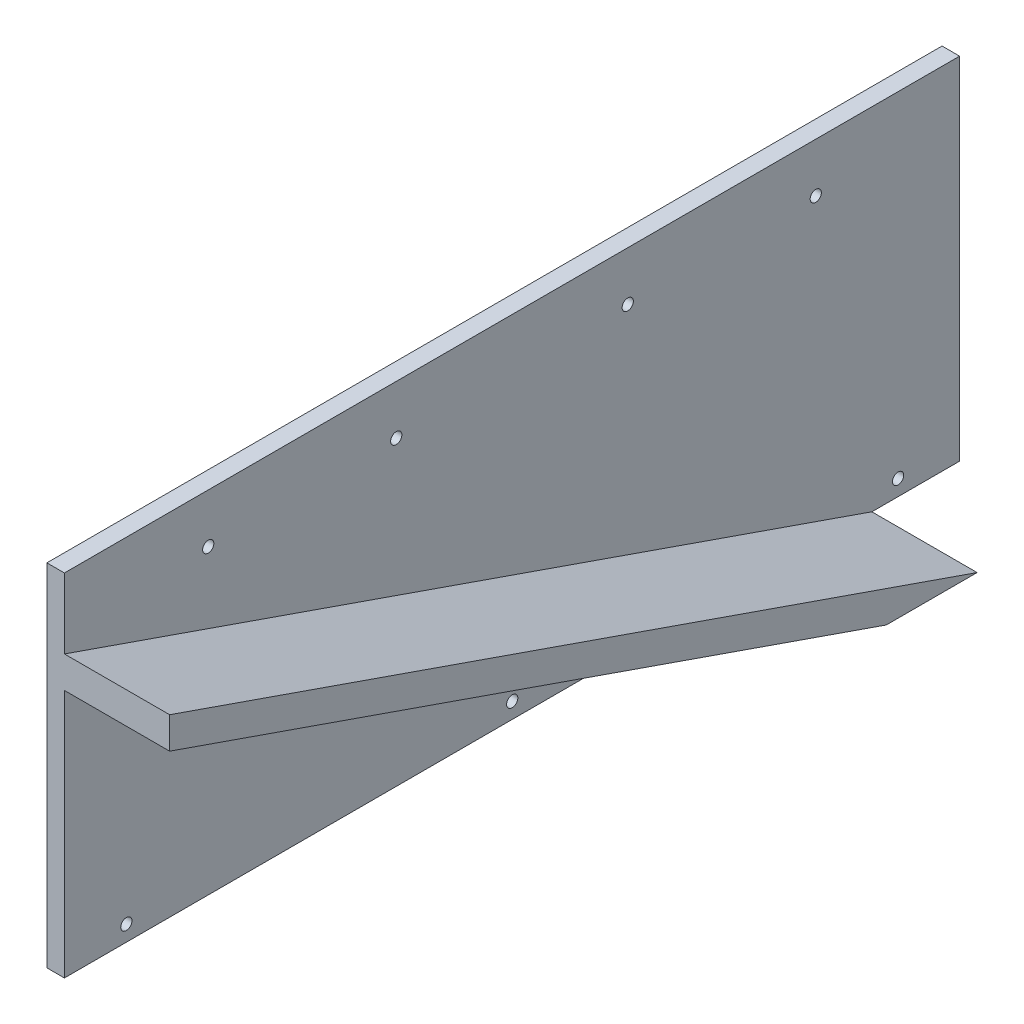
ISO-10303-21;
HEADER;
FILE_DESCRIPTION(('STEP AP214'),'2;1');
FILE_NAME('part.step','',(''),(''),'','','');
FILE_SCHEMA(('AUTOMOTIVE_DESIGN { 1 0 10303 214 1 1 1 1 }'));
ENDSEC;
DATA;
#1=APPLICATION_CONTEXT('core data for automotive mechanical design processes');
#2=APPLICATION_PROTOCOL_DEFINITION('international standard','automotive_design',2000,#1);
#3=PRODUCT_CONTEXT('',#1,'mechanical');
#4=PRODUCT('Part','Part','',(#3));
#5=PRODUCT_RELATED_PRODUCT_CATEGORY('part','',(#4));
#6=PRODUCT_DEFINITION_FORMATION('','',#4);
#7=PRODUCT_DEFINITION_CONTEXT('part definition',#1,'design');
#8=PRODUCT_DEFINITION('design','',#6,#7);
#9=PRODUCT_DEFINITION_SHAPE('','',#8);
#10=(LENGTH_UNIT() NAMED_UNIT(*) SI_UNIT(.MILLI.,.METRE.));
#11=(NAMED_UNIT(*) PLANE_ANGLE_UNIT() SI_UNIT($,.RADIAN.));
#12=(NAMED_UNIT(*) SI_UNIT($,.STERADIAN.) SOLID_ANGLE_UNIT());
#13=UNCERTAINTY_MEASURE_WITH_UNIT(LENGTH_MEASURE(1.E-05),#10,'distance_accuracy_value','');
#14=(GEOMETRIC_REPRESENTATION_CONTEXT(3) GLOBAL_UNCERTAINTY_ASSIGNED_CONTEXT((#13)) GLOBAL_UNIT_ASSIGNED_CONTEXT((#10,
#11,#12)) REPRESENTATION_CONTEXT('',''));
#15=CARTESIAN_POINT('',(0.,0.,0.));
#16=DIRECTION('',(0.,0.,1.));
#17=DIRECTION('',(1.,0.,0.));
#18=AXIS2_PLACEMENT_3D('',#15,#16,#17);
#19=CARTESIAN_POINT('',(171.2,-90.,-19.2));
#20=DIRECTION('',(1.,0.,0.));
#21=DIRECTION('',(0.,0.,-1.));
#22=AXIS2_PLACEMENT_3D('',#19,#20,#21);
#23=PLANE('',#22);
#24=CARTESIAN_POINT('',(171.2,-85.5,-1.65549429597915));
#25=DIRECTION('',(1.,0.,0.));
#26=DIRECTION('',(0.,0.,-1.));
#27=AXIS2_PLACEMENT_3D('',#24,#25,#26);
#28=CIRCLE('',#27,1.6);
#29=CARTESIAN_POINT('',(171.2,-85.5,-3.25549429597916));
#30=VERTEX_POINT('',#29);
#31=EDGE_CURVE('E333',#30,#30,#28,.F.);
#32=ORIENTED_EDGE('',*,*,#31,.T.);
#33=EDGE_LOOP('',(#32));
#34=FACE_BOUND('',#33,.T.);
#35=DIRECTION('',(0.,0.328265971607174,0.944585333299643));
#36=VECTOR('',#35,1.);
#37=CARTESIAN_POINT('',(171.2,-82.1001669584005,28.5317695772026));
#38=LINE('',#37,#36);
#39=CARTESIAN_POINT('',(171.2,-90.,5.8000000000001));
#40=VERTEX_POINT('',#39);
#41=CARTESIAN_POINT('',(171.2,-10.,236.));
#42=VERTEX_POINT('',#41);
#43=EDGE_CURVE('E64',#40,#42,#38,.T.);
#44=ORIENTED_EDGE('',*,*,#43,.F.);
#45=DIRECTION('',(0.,0.,-1.));
#46=VECTOR('',#45,1.);
#47=CARTESIAN_POINT('',(171.2,-90.,-19.2));
#48=LINE('',#47,#46);
#49=CARTESIAN_POINT('',(171.2,-90.,-19.2));
#50=VERTEX_POINT('',#49);
#51=EDGE_CURVE('E175',#40,#50,#48,.T.);
#52=ORIENTED_EDGE('',*,*,#51,.T.);
#53=DIRECTION('',(0.,1.,0.));
#54=VECTOR('',#53,1.);
#55=CARTESIAN_POINT('',(171.2,-90.,-19.2));
#56=LINE('',#55,#54);
#57=CARTESIAN_POINT('',(171.2,10.,-19.2));
#58=VERTEX_POINT('',#57);
#59=EDGE_CURVE('E204',#50,#58,#56,.T.);
#60=ORIENTED_EDGE('',*,*,#59,.T.);
#61=DIRECTION('',(0.,0.,-1.));
#62=VECTOR('',#61,1.);
#63=CARTESIAN_POINT('',(171.2,10.,-19.2));
#64=LINE('',#63,#62);
#65=CARTESIAN_POINT('',(171.2,10.,236.));
#66=VERTEX_POINT('',#65);
#67=EDGE_CURVE('E191',#66,#58,#64,.T.);
#68=ORIENTED_EDGE('',*,*,#67,.F.);
#69=DIRECTION('',(0.,1.,0.));
#70=VECTOR('',#69,1.);
#71=CARTESIAN_POINT('',(171.2,-90.,236.));
#72=LINE('',#71,#70);
#73=EDGE_CURVE('E69',#42,#66,#72,.T.);
#74=ORIENTED_EDGE('',*,*,#73,.F.);
#75=EDGE_LOOP('',(#44,#52,#60,#68,#74));
#76=FACE_BOUND('',#75,.T.);
#77=CARTESIAN_POINT('',(171.2,-3.99999999999998,195.));
#78=DIRECTION('',(-1.,0.,0.));
#79=DIRECTION('',(0.,0.,1.));
#80=AXIS2_PLACEMENT_3D('',#77,#78,#79);
#81=CIRCLE('',#80,1.6);
#82=CARTESIAN_POINT('',(171.2,-3.99999999999998,196.6));
#83=VERTEX_POINT('',#82);
#84=EDGE_CURVE('E144',#83,#83,#81,.T.);
#85=ORIENTED_EDGE('',*,*,#84,.T.);
#86=EDGE_LOOP('',(#85));
#87=FACE_BOUND('',#86,.T.);
#88=CARTESIAN_POINT('',(171.2,-3.99999999999998,21.8));
#89=DIRECTION('',(1.,0.,0.));
#90=DIRECTION('',(0.,0.,-1.));
#91=AXIS2_PLACEMENT_3D('',#88,#89,#90);
#92=CIRCLE('',#91,1.6);
#93=CARTESIAN_POINT('',(171.2,-3.99999999999998,20.2));
#94=VERTEX_POINT('',#93);
#95=EDGE_CURVE('E153',#94,#94,#92,.T.);
#96=ORIENTED_EDGE('',*,*,#95,.F.);
#97=EDGE_LOOP('',(#96));
#98=FACE_BOUND('',#97,.T.);
#99=CARTESIAN_POINT('',(171.2,-3.99999999999998,141.4));
#100=DIRECTION('',(-1.,0.,0.));
#101=DIRECTION('',(0.,0.,1.));
#102=AXIS2_PLACEMENT_3D('',#99,#100,#101);
#103=CIRCLE('',#102,1.60000000000001);
#104=CARTESIAN_POINT('',(171.2,-3.99999999999998,143.));
#105=VERTEX_POINT('',#104);
#106=EDGE_CURVE('E162',#105,#105,#103,.T.);
#107=ORIENTED_EDGE('',*,*,#106,.T.);
#108=EDGE_LOOP('',(#107));
#109=FACE_BOUND('',#108,.T.);
#110=CARTESIAN_POINT('',(171.2,-3.99999999999998,75.4));
#111=DIRECTION('',(1.,0.,0.));
#112=DIRECTION('',(0.,0.,-1.));
#113=AXIS2_PLACEMENT_3D('',#110,#111,#112);
#114=CIRCLE('',#113,1.60000000000001);
#115=CARTESIAN_POINT('',(171.2,-3.99999999999998,73.8));
#116=VERTEX_POINT('',#115);
#117=EDGE_CURVE('E166',#116,#116,#114,.T.);
#118=ORIENTED_EDGE('',*,*,#117,.F.);
#119=EDGE_LOOP('',(#118));
#120=FACE_BOUND('',#119,.T.);
#121=ADVANCED_FACE('F46',(#34,#76,#87,#98,#109,#120),#23,.T.);
#122=CARTESIAN_POINT('',(171.2,-90.,236.));
#123=DIRECTION('',(0.,0.,1.));
#124=DIRECTION('',(1.,0.,0.));
#125=AXIS2_PLACEMENT_3D('',#122,#123,#124);
#126=PLANE('',#125);
#127=DIRECTION('',(1.,0.,0.));
#128=VECTOR('',#127,1.);
#129=CARTESIAN_POINT('',(171.2,10.,236.));
#130=LINE('',#129,#128);
#131=CARTESIAN_POINT('',(166.2,10.,236.));
#132=VERTEX_POINT('',#131);
#133=EDGE_CURVE('E171',#132,#66,#130,.T.);
#134=ORIENTED_EDGE('',*,*,#133,.F.);
#135=DIRECTION('',(0.,1.,0.));
#136=VECTOR('',#135,1.);
#137=CARTESIAN_POINT('',(166.2,-90.,236.));
#138=LINE('',#137,#136);
#139=CARTESIAN_POINT('',(166.2,-90.,236.));
#140=VERTEX_POINT('',#139);
#141=EDGE_CURVE('E11',#140,#132,#138,.T.);
#142=ORIENTED_EDGE('',*,*,#141,.F.);
#143=DIRECTION('',(1.,0.,0.));
#144=VECTOR('',#143,1.);
#145=CARTESIAN_POINT('',(171.2,-90.,236.));
#146=LINE('',#145,#144);
#147=CARTESIAN_POINT('',(171.2,-90.,236.));
#148=VERTEX_POINT('',#147);
#149=EDGE_CURVE('E172',#140,#148,#146,.T.);
#150=ORIENTED_EDGE('',*,*,#149,.T.);
#151=CARTESIAN_POINT('',(171.2,-19.,236.));
#152=VERTEX_POINT('',#151);
#153=EDGE_CURVE('E137',#148,#152,#72,.T.);
#154=ORIENTED_EDGE('',*,*,#153,.T.);
#155=DIRECTION('',(-1.,0.,0.));
#156=VECTOR('',#155,1.);
#157=CARTESIAN_POINT('',(201.2,-19.,236.));
#158=LINE('',#157,#156);
#159=CARTESIAN_POINT('',(201.2,-19.,236.));
#160=VERTEX_POINT('',#159);
#161=EDGE_CURVE('E116',#160,#152,#158,.T.);
#162=ORIENTED_EDGE('',*,*,#161,.F.);
#163=DIRECTION('',(0.,-1.,0.));
#164=VECTOR('',#163,1.);
#165=CARTESIAN_POINT('',(201.2,0.,236.));
#166=LINE('',#165,#164);
#167=CARTESIAN_POINT('',(201.2,-10.,236.));
#168=VERTEX_POINT('',#167);
#169=EDGE_CURVE('E123',#168,#160,#166,.T.);
#170=ORIENTED_EDGE('',*,*,#169,.F.);
#171=DIRECTION('',(-1.,0.,0.));
#172=VECTOR('',#171,1.);
#173=CARTESIAN_POINT('',(201.2,-10.,236.));
#174=LINE('',#173,#172);
#175=EDGE_CURVE('E279',#168,#42,#174,.T.);
#176=ORIENTED_EDGE('',*,*,#175,.T.);
#177=ORIENTED_EDGE('',*,*,#73,.T.);
#178=EDGE_LOOP('',(#134,#142,#150,#154,#162,#170,#176,#177));
#179=FACE_BOUND('',#178,.T.);
#180=ADVANCED_FACE('F48',(#179),#126,.T.);
#181=CARTESIAN_POINT('',(166.2,-90.,236.));
#182=DIRECTION('',(-1.,0.,0.));
#183=DIRECTION('',(0.,0.,1.));
#184=AXIS2_PLACEMENT_3D('',#181,#182,#183);
#185=PLANE('',#184);
#186=CARTESIAN_POINT('',(166.2,-85.5,-1.65549429597915));
#187=DIRECTION('',(-1.,0.,0.));
#188=DIRECTION('',(0.,0.,1.));
#189=AXIS2_PLACEMENT_3D('',#186,#187,#188);
#190=CIRCLE('',#189,1.6);
#191=CARTESIAN_POINT('',(166.2,-85.5,-0.0554942959791476));
#192=VERTEX_POINT('',#191);
#193=EDGE_CURVE('E50',#192,#192,#190,.T.);
#194=ORIENTED_EDGE('',*,*,#193,.F.);
#195=EDGE_LOOP('',(#194));
#196=FACE_BOUND('',#195,.T.);
#197=CARTESIAN_POINT('',(166.2,-85.5,218.344505704021));
#198=DIRECTION('',(-1.,0.,0.));
#199=DIRECTION('',(0.,0.,1.));
#200=AXIS2_PLACEMENT_3D('',#197,#198,#199);
#201=CIRCLE('',#200,1.60000000000002);
#202=CARTESIAN_POINT('',(166.2,-85.5,219.944505704021));
#203=VERTEX_POINT('',#202);
#204=EDGE_CURVE('E275',#203,#203,#201,.T.);
#205=ORIENTED_EDGE('',*,*,#204,.F.);
#206=EDGE_LOOP('',(#205));
#207=FACE_BOUND('',#206,.T.);
#208=CARTESIAN_POINT('',(166.2,-85.5,108.344505704021));
#209=DIRECTION('',(-1.,0.,0.));
#210=DIRECTION('',(0.,0.,1.));
#211=AXIS2_PLACEMENT_3D('',#208,#209,#210);
#212=CIRCLE('',#211,1.60000000000001);
#213=CARTESIAN_POINT('',(166.2,-85.5,109.944505704021));
#214=VERTEX_POINT('',#213);
#215=EDGE_CURVE('E335',#214,#214,#212,.T.);
#216=ORIENTED_EDGE('',*,*,#215,.F.);
#217=EDGE_LOOP('',(#216));
#218=FACE_BOUND('',#217,.T.);
#219=CARTESIAN_POINT('',(166.2,-3.99999999999998,195.));
#220=DIRECTION('',(1.,0.,0.));
#221=DIRECTION('',(0.,0.,-1.));
#222=AXIS2_PLACEMENT_3D('',#219,#220,#221);
#223=CIRCLE('',#222,1.6);
#224=CARTESIAN_POINT('',(166.2,-3.99999999999998,193.4));
#225=VERTEX_POINT('',#224);
#226=EDGE_CURVE('E139',#225,#225,#223,.T.);
#227=ORIENTED_EDGE('',*,*,#226,.T.);
#228=EDGE_LOOP('',(#227));
#229=FACE_BOUND('',#228,.T.);
#230=CARTESIAN_POINT('',(166.2,-3.99999999999998,21.8));
#231=DIRECTION('',(-1.,0.,0.));
#232=DIRECTION('',(0.,0.,1.));
#233=AXIS2_PLACEMENT_3D('',#230,#231,#232);
#234=CIRCLE('',#233,1.6);
#235=CARTESIAN_POINT('',(166.2,-3.99999999999998,23.4));
#236=VERTEX_POINT('',#235);
#237=EDGE_CURVE('E154',#236,#236,#234,.T.);
#238=ORIENTED_EDGE('',*,*,#237,.F.);
#239=EDGE_LOOP('',(#238));
#240=FACE_BOUND('',#239,.T.);
#241=CARTESIAN_POINT('',(166.2,-3.99999999999998,141.4));
#242=DIRECTION('',(1.,0.,0.));
#243=DIRECTION('',(0.,0.,-1.));
#244=AXIS2_PLACEMENT_3D('',#241,#242,#243);
#245=CIRCLE('',#244,1.60000000000001);
#246=CARTESIAN_POINT('',(166.2,-3.99999999999998,139.8));
#247=VERTEX_POINT('',#246);
#248=EDGE_CURVE('E158',#247,#247,#245,.T.);
#249=ORIENTED_EDGE('',*,*,#248,.T.);
#250=EDGE_LOOP('',(#249));
#251=FACE_BOUND('',#250,.T.);
#252=CARTESIAN_POINT('',(166.2,-3.99999999999998,75.4));
#253=DIRECTION('',(-1.,0.,0.));
#254=DIRECTION('',(0.,0.,1.));
#255=AXIS2_PLACEMENT_3D('',#252,#253,#254);
#256=CIRCLE('',#255,1.60000000000001);
#257=CARTESIAN_POINT('',(166.2,-3.99999999999998,77.));
#258=VERTEX_POINT('',#257);
#259=EDGE_CURVE('E167',#258,#258,#256,.T.);
#260=ORIENTED_EDGE('',*,*,#259,.F.);
#261=EDGE_LOOP('',(#260));
#262=FACE_BOUND('',#261,.T.);
#263=DIRECTION('',(0.,0.,1.));
#264=VECTOR('',#263,1.);
#265=CARTESIAN_POINT('',(166.2,10.,236.));
#266=LINE('',#265,#264);
#267=CARTESIAN_POINT('',(166.2,10.,-19.2));
#268=VERTEX_POINT('',#267);
#269=EDGE_CURVE('E176',#268,#132,#266,.T.);
#270=ORIENTED_EDGE('',*,*,#269,.F.);
#271=DIRECTION('',(0.,1.,0.));
#272=VECTOR('',#271,1.);
#273=CARTESIAN_POINT('',(166.2,-90.,-19.2));
#274=LINE('',#273,#272);
#275=CARTESIAN_POINT('',(166.2,-90.,-19.2));
#276=VERTEX_POINT('',#275);
#277=EDGE_CURVE('E56',#276,#268,#274,.T.);
#278=ORIENTED_EDGE('',*,*,#277,.F.);
#279=DIRECTION('',(0.,0.,1.));
#280=VECTOR('',#279,1.);
#281=CARTESIAN_POINT('',(166.2,-90.,236.));
#282=LINE('',#281,#280);
#283=EDGE_CURVE('E184',#276,#140,#282,.T.);
#284=ORIENTED_EDGE('',*,*,#283,.T.);
#285=ORIENTED_EDGE('',*,*,#141,.T.);
#286=EDGE_LOOP('',(#270,#278,#284,#285));
#287=FACE_BOUND('',#286,.T.);
#288=ADVANCED_FACE('F246',(#196,#207,#218,#229,#240,#251,#262,#287),#185,.T.);
#289=CARTESIAN_POINT('',(166.2,-90.,-19.2));
#290=DIRECTION('',(0.,0.,-1.));
#291=DIRECTION('',(-1.,0.,0.));
#292=AXIS2_PLACEMENT_3D('',#289,#290,#291);
#293=PLANE('',#292);
#294=DIRECTION('',(-1.,0.,0.));
#295=VECTOR('',#294,1.);
#296=CARTESIAN_POINT('',(166.2,10.,-19.2));
#297=LINE('',#296,#295);
#298=EDGE_CURVE('E195',#58,#268,#297,.T.);
#299=ORIENTED_EDGE('',*,*,#298,.F.);
#300=ORIENTED_EDGE('',*,*,#59,.F.);
#301=DIRECTION('',(-1.,0.,0.));
#302=VECTOR('',#301,1.);
#303=CARTESIAN_POINT('',(166.2,-90.,-19.2));
#304=LINE('',#303,#302);
#305=EDGE_CURVE('E180',#50,#276,#304,.T.);
#306=ORIENTED_EDGE('',*,*,#305,.T.);
#307=ORIENTED_EDGE('',*,*,#277,.T.);
#308=EDGE_LOOP('',(#299,#300,#306,#307));
#309=FACE_BOUND('',#308,.T.);
#310=ADVANCED_FACE('F249',(#309),#293,.T.);
#311=CARTESIAN_POINT('',(171.2,-85.5,218.344505704021));
#312=DIRECTION('',(1.,0.,0.));
#313=DIRECTION('',(0.,0.,-1.));
#314=AXIS2_PLACEMENT_3D('',#311,#312,#313);
#315=CIRCLE('',#314,1.60000000000002);
#316=CARTESIAN_POINT('',(171.2,-85.5,216.744505704021));
#317=VERTEX_POINT('',#316);
#318=EDGE_CURVE('E262',#317,#317,#315,.F.);
#319=ORIENTED_EDGE('',*,*,#318,.T.);
#320=EDGE_LOOP('',(#319));
#321=FACE_BOUND('',#320,.T.);
#322=CARTESIAN_POINT('',(171.2,-85.5,108.344505704021));
#323=DIRECTION('',(1.,0.,0.));
#324=DIRECTION('',(0.,0.,-1.));
#325=AXIS2_PLACEMENT_3D('',#322,#323,#324);
#326=CIRCLE('',#325,1.60000000000001);
#327=CARTESIAN_POINT('',(171.2,-85.5,106.744505704021));
#328=VERTEX_POINT('',#327);
#329=EDGE_CURVE('E266',#328,#328,#326,.F.);
#330=ORIENTED_EDGE('',*,*,#329,.T.);
#331=EDGE_LOOP('',(#330));
#332=FACE_BOUND('',#331,.T.);
#333=DIRECTION('',(0.,-0.328265971607174,-0.944585333299643));
#334=VECTOR('',#333,1.);
#335=CARTESIAN_POINT('',(171.2,-90.1303400253637,31.322446577016));
#336=LINE('',#335,#334);
#337=CARTESIAN_POINT('',(171.2,-90.,31.6974999999999));
#338=VERTEX_POINT('',#337);
#339=EDGE_CURVE('E267',#152,#338,#336,.T.);
#340=ORIENTED_EDGE('',*,*,#339,.F.);
#341=ORIENTED_EDGE('',*,*,#153,.F.);
#342=EDGE_CURVE('E177',#148,#338,#48,.T.);
#343=ORIENTED_EDGE('',*,*,#342,.T.);
#344=EDGE_LOOP('',(#340,#341,#343));
#345=FACE_BOUND('',#344,.T.);
#346=ADVANCED_FACE('F220',(#321,#332,#345),#23,.T.);
#347=CARTESIAN_POINT('',(0.,-90.,0.));
#348=DIRECTION('',(0.,-1.,0.));
#349=DIRECTION('',(0.,0.,-1.));
#350=AXIS2_PLACEMENT_3D('',#347,#348,#349);
#351=PLANE('',#350);
#352=ORIENTED_EDGE('',*,*,#149,.F.);
#353=ORIENTED_EDGE('',*,*,#283,.F.);
#354=ORIENTED_EDGE('',*,*,#305,.F.);
#355=ORIENTED_EDGE('',*,*,#51,.F.);
#356=DIRECTION('',(-1.,0.,0.));
#357=VECTOR('',#356,1.);
#358=CARTESIAN_POINT('',(201.2,-90.,5.80000000000005));
#359=LINE('',#358,#357);
#360=CARTESIAN_POINT('',(201.2,-90.,5.80000000000005));
#361=VERTEX_POINT('',#360);
#362=EDGE_CURVE('E146',#361,#40,#359,.T.);
#363=ORIENTED_EDGE('',*,*,#362,.F.);
#364=DIRECTION('',(0.,0.,-1.));
#365=VECTOR('',#364,1.);
#366=CARTESIAN_POINT('',(201.2,-90.,0.));
#367=LINE('',#366,#365);
#368=CARTESIAN_POINT('',(201.2,-90.,31.6974999999999));
#369=VERTEX_POINT('',#368);
#370=EDGE_CURVE('E122',#369,#361,#367,.T.);
#371=ORIENTED_EDGE('',*,*,#370,.F.);
#372=DIRECTION('',(-1.,0.,0.));
#373=VECTOR('',#372,1.);
#374=CARTESIAN_POINT('',(201.2,-90.,31.6974999999999));
#375=LINE('',#374,#373);
#376=EDGE_CURVE('E118',#369,#338,#375,.T.);
#377=ORIENTED_EDGE('',*,*,#376,.T.);
#378=ORIENTED_EDGE('',*,*,#342,.F.);
#379=EDGE_LOOP('',(#352,#353,#354,#355,#363,#371,#377,#378));
#380=FACE_BOUND('',#379,.T.);
#381=ADVANCED_FACE('F238',(#380),#351,.T.);
#382=CARTESIAN_POINT('',(0.,10.,0.));
#383=DIRECTION('',(0.,-1.,0.));
#384=DIRECTION('',(0.,0.,-1.));
#385=AXIS2_PLACEMENT_3D('',#382,#383,#384);
#386=PLANE('',#385);
#387=ORIENTED_EDGE('',*,*,#133,.T.);
#388=ORIENTED_EDGE('',*,*,#67,.T.);
#389=ORIENTED_EDGE('',*,*,#298,.T.);
#390=ORIENTED_EDGE('',*,*,#269,.T.);
#391=EDGE_LOOP('',(#387,#388,#389,#390));
#392=FACE_BOUND('',#391,.T.);
#393=ADVANCED_FACE('F228',(#392),#386,.F.);
#394=CARTESIAN_POINT('',(233.2,-3.99999999999997,75.4));
#395=DIRECTION('',(-1.,0.,0.));
#396=DIRECTION('',(0.,-1.,0.));
#397=AXIS2_PLACEMENT_3D('',#394,#395,#396);
#398=CYLINDRICAL_SURFACE('',#397,1.60000000000001);
#399=ORIENTED_EDGE('',*,*,#259,.T.);
#400=EDGE_LOOP('',(#399));
#401=FACE_BOUND('',#400,.T.);
#402=ORIENTED_EDGE('',*,*,#117,.T.);
#403=EDGE_LOOP('',(#402));
#404=FACE_BOUND('',#403,.T.);
#405=ADVANCED_FACE('F225',(#401,#404),#398,.F.);
#406=CARTESIAN_POINT('',(233.2,-3.99999999999997,141.4));
#407=DIRECTION('',(-1.,0.,0.));
#408=DIRECTION('',(0.,-1.,0.));
#409=AXIS2_PLACEMENT_3D('',#406,#407,#408);
#410=CYLINDRICAL_SURFACE('',#409,1.60000000000001);
#411=ORIENTED_EDGE('',*,*,#248,.F.);
#412=EDGE_LOOP('',(#411));
#413=FACE_BOUND('',#412,.T.);
#414=ORIENTED_EDGE('',*,*,#106,.F.);
#415=EDGE_LOOP('',(#414));
#416=FACE_BOUND('',#415,.T.);
#417=ADVANCED_FACE('F227',(#413,#416),#410,.F.);
#418=CARTESIAN_POINT('',(233.2,-3.99999999999997,21.8));
#419=DIRECTION('',(-1.,0.,0.));
#420=DIRECTION('',(0.,-1.,0.));
#421=AXIS2_PLACEMENT_3D('',#418,#419,#420);
#422=CYLINDRICAL_SURFACE('',#421,1.6);
#423=ORIENTED_EDGE('',*,*,#237,.T.);
#424=EDGE_LOOP('',(#423));
#425=FACE_BOUND('',#424,.T.);
#426=ORIENTED_EDGE('',*,*,#95,.T.);
#427=EDGE_LOOP('',(#426));
#428=FACE_BOUND('',#427,.T.);
#429=ADVANCED_FACE('F215',(#425,#428),#422,.F.);
#430=CARTESIAN_POINT('',(233.2,-3.99999999999997,195.));
#431=DIRECTION('',(-1.,0.,0.));
#432=DIRECTION('',(0.,-1.,0.));
#433=AXIS2_PLACEMENT_3D('',#430,#431,#432);
#434=CYLINDRICAL_SURFACE('',#433,1.6);
#435=ORIENTED_EDGE('',*,*,#226,.F.);
#436=EDGE_LOOP('',(#435));
#437=FACE_BOUND('',#436,.T.);
#438=ORIENTED_EDGE('',*,*,#84,.F.);
#439=EDGE_LOOP('',(#438));
#440=FACE_BOUND('',#439,.T.);
#441=ADVANCED_FACE('F298',(#437,#440),#434,.F.);
#442=CARTESIAN_POINT('',(201.2,-90.1303400253637,31.322446577016));
#443=DIRECTION('',(0.,0.944585333299643,-0.328265971607174));
#444=DIRECTION('',(0.,0.328265971607174,0.944585333299643));
#445=AXIS2_PLACEMENT_3D('',#442,#443,#444);
#446=PLANE('',#445);
#447=ORIENTED_EDGE('',*,*,#339,.T.);
#448=ORIENTED_EDGE('',*,*,#376,.F.);
#449=DIRECTION('',(0.,-0.328265971607174,-0.944585333299643));
#450=VECTOR('',#449,1.);
#451=CARTESIAN_POINT('',(201.2,-90.1303400253637,31.322446577016));
#452=LINE('',#451,#450);
#453=EDGE_CURVE('E111',#160,#369,#452,.T.);
#454=ORIENTED_EDGE('',*,*,#453,.F.);
#455=ORIENTED_EDGE('',*,*,#161,.T.);
#456=EDGE_LOOP('',(#447,#448,#454,#455));
#457=FACE_BOUND('',#456,.T.);
#458=ADVANCED_FACE('F114',(#457),#446,.F.);
#459=CARTESIAN_POINT('',(201.2,-82.1001669584005,28.5317695772026));
#460=DIRECTION('',(0.,-0.944585333299643,0.328265971607174));
#461=DIRECTION('',(0.,-0.328265971607174,-0.944585333299643));
#462=AXIS2_PLACEMENT_3D('',#459,#460,#461);
#463=PLANE('',#462);
#464=ORIENTED_EDGE('',*,*,#43,.T.);
#465=ORIENTED_EDGE('',*,*,#175,.F.);
#466=DIRECTION('',(0.,0.328265971607174,0.944585333299643));
#467=VECTOR('',#466,1.);
#468=CARTESIAN_POINT('',(201.2,-82.1001669584005,28.5317695772026));
#469=LINE('',#468,#467);
#470=EDGE_CURVE('E128',#361,#168,#469,.T.);
#471=ORIENTED_EDGE('',*,*,#470,.F.);
#472=ORIENTED_EDGE('',*,*,#362,.T.);
#473=EDGE_LOOP('',(#464,#465,#471,#472));
#474=FACE_BOUND('',#473,.T.);
#475=ADVANCED_FACE('F285',(#474),#463,.F.);
#476=CARTESIAN_POINT('',(201.2,0.,0.));
#477=DIRECTION('',(1.,0.,0.));
#478=DIRECTION('',(0.,0.,-1.));
#479=AXIS2_PLACEMENT_3D('',#476,#477,#478);
#480=PLANE('',#479);
#481=ORIENTED_EDGE('',*,*,#169,.T.);
#482=ORIENTED_EDGE('',*,*,#453,.T.);
#483=ORIENTED_EDGE('',*,*,#370,.T.);
#484=ORIENTED_EDGE('',*,*,#470,.T.);
#485=EDGE_LOOP('',(#481,#482,#483,#484));
#486=FACE_BOUND('',#485,.T.);
#487=ADVANCED_FACE('F126',(#486),#480,.T.);
#488=CARTESIAN_POINT('',(175.725483399594,-85.5,108.344505704021));
#489=DIRECTION('',(-1.,0.,0.));
#490=DIRECTION('',(0.,0.,1.));
#491=AXIS2_PLACEMENT_3D('',#488,#489,#490);
#492=CYLINDRICAL_SURFACE('',#491,1.60000000000001);
#493=ORIENTED_EDGE('',*,*,#215,.T.);
#494=EDGE_LOOP('',(#493));
#495=FACE_BOUND('',#494,.T.);
#496=ORIENTED_EDGE('',*,*,#329,.F.);
#497=EDGE_LOOP('',(#496));
#498=FACE_BOUND('',#497,.T.);
#499=ADVANCED_FACE('F315',(#495,#498),#492,.F.);
#500=CARTESIAN_POINT('',(175.725483399594,-85.5,218.344505704021));
#501=DIRECTION('',(-1.,0.,0.));
#502=DIRECTION('',(0.,0.,1.));
#503=AXIS2_PLACEMENT_3D('',#500,#501,#502);
#504=CYLINDRICAL_SURFACE('',#503,1.60000000000002);
#505=ORIENTED_EDGE('',*,*,#204,.T.);
#506=EDGE_LOOP('',(#505));
#507=FACE_BOUND('',#506,.T.);
#508=ORIENTED_EDGE('',*,*,#318,.F.);
#509=EDGE_LOOP('',(#508));
#510=FACE_BOUND('',#509,.T.);
#511=ADVANCED_FACE('F318',(#507,#510),#504,.F.);
#512=CARTESIAN_POINT('',(175.725483399594,-85.5,-1.65549429597915));
#513=DIRECTION('',(-1.,0.,0.));
#514=DIRECTION('',(0.,0.,1.));
#515=AXIS2_PLACEMENT_3D('',#512,#513,#514);
#516=CYLINDRICAL_SURFACE('',#515,1.6);
#517=ORIENTED_EDGE('',*,*,#193,.T.);
#518=EDGE_LOOP('',(#517));
#519=FACE_BOUND('',#518,.T.);
#520=ORIENTED_EDGE('',*,*,#31,.F.);
#521=EDGE_LOOP('',(#520));
#522=FACE_BOUND('',#521,.T.);
#523=ADVANCED_FACE('F322',(#519,#522),#516,.F.);
#524=CLOSED_SHELL('',(#121,#180,#288,#310,#346,#381,#393,#405,#417,#429,#441,#458,#475,#487,
#499,#511,#523));
#525=MANIFOLD_SOLID_BREP('B2',#524);
#526=ADVANCED_BREP_SHAPE_REPRESENTATION('',(#18,#525),#14);
#527=SHAPE_DEFINITION_REPRESENTATION(#9,#526);
ENDSEC;
END-ISO-10303-21;
